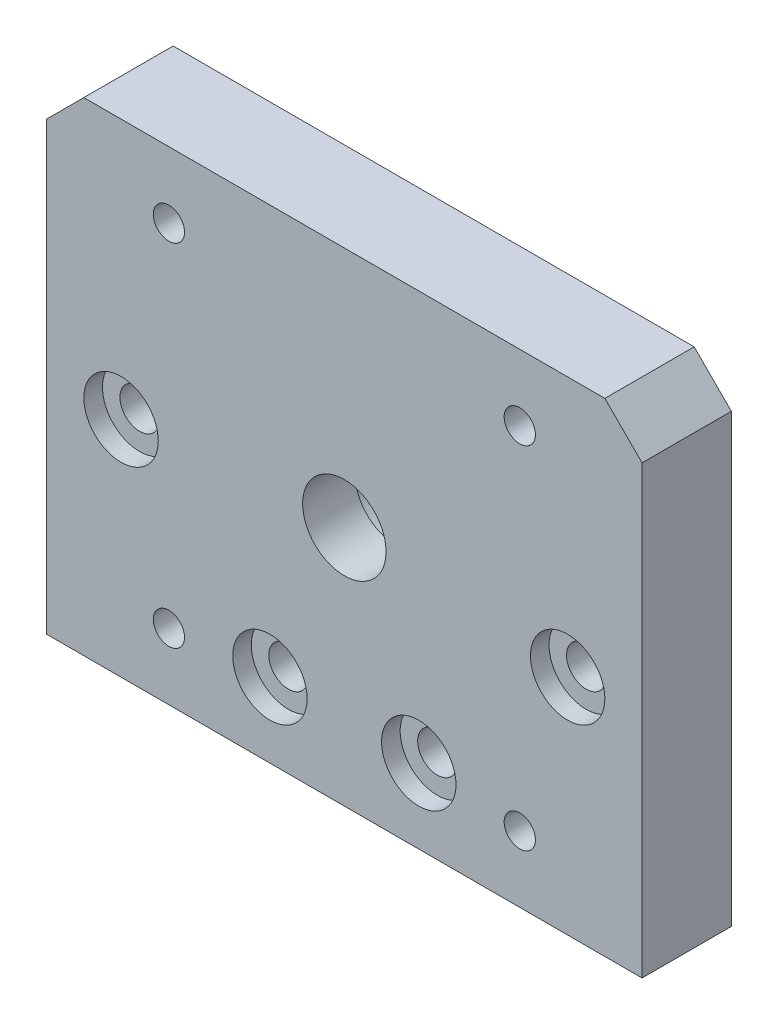
ISO-10303-21;
HEADER;
FILE_DESCRIPTION(('STEP AP214'),'2;1');
FILE_NAME('part.step','',(''),(''),'','','');
FILE_SCHEMA(('AUTOMOTIVE_DESIGN { 1 0 10303 214 1 1 1 1 }'));
ENDSEC;
DATA;
#1=APPLICATION_CONTEXT('core data for automotive mechanical design processes');
#2=APPLICATION_PROTOCOL_DEFINITION('international standard','automotive_design',2000,#1);
#3=PRODUCT_CONTEXT('',#1,'mechanical');
#4=PRODUCT('Part','Part','',(#3));
#5=PRODUCT_RELATED_PRODUCT_CATEGORY('part','',(#4));
#6=PRODUCT_DEFINITION_FORMATION('','',#4);
#7=PRODUCT_DEFINITION_CONTEXT('part definition',#1,'design');
#8=PRODUCT_DEFINITION('design','',#6,#7);
#9=PRODUCT_DEFINITION_SHAPE('','',#8);
#10=(LENGTH_UNIT() NAMED_UNIT(*) SI_UNIT(.MILLI.,.METRE.));
#11=(NAMED_UNIT(*) PLANE_ANGLE_UNIT() SI_UNIT($,.RADIAN.));
#12=(NAMED_UNIT(*) SI_UNIT($,.STERADIAN.) SOLID_ANGLE_UNIT());
#13=UNCERTAINTY_MEASURE_WITH_UNIT(LENGTH_MEASURE(1.E-05),#10,'distance_accuracy_value','');
#14=(GEOMETRIC_REPRESENTATION_CONTEXT(3) GLOBAL_UNCERTAINTY_ASSIGNED_CONTEXT((#13)) GLOBAL_UNIT_ASSIGNED_CONTEXT((#10,
#11,#12)) REPRESENTATION_CONTEXT('',''));
#15=CARTESIAN_POINT('',(0.,0.,0.));
#16=DIRECTION('',(0.,0.,1.));
#17=DIRECTION('',(1.,0.,0.));
#18=AXIS2_PLACEMENT_3D('',#15,#16,#17);
#19=CARTESIAN_POINT('',(0.,0.,0.));
#20=DIRECTION('',(0.,0.,1.));
#21=DIRECTION('',(1.,0.,0.));
#22=AXIS2_PLACEMENT_3D('',#19,#20,#21);
#23=CYLINDRICAL_SURFACE('',#22,5.6);
#24=CARTESIAN_POINT('',(0.,0.,12.));
#25=DIRECTION('',(0.,0.,1.));
#26=DIRECTION('',(1.,0.,0.));
#27=AXIS2_PLACEMENT_3D('',#24,#25,#26);
#28=CIRCLE('',#27,5.6);
#29=CARTESIAN_POINT('',(5.6,0.,12.));
#30=VERTEX_POINT('',#29);
#31=EDGE_CURVE('E340',#30,#30,#28,.T.);
#32=ORIENTED_EDGE('',*,*,#31,.T.);
#33=EDGE_LOOP('',(#32));
#34=FACE_BOUND('',#33,.T.);
#35=CARTESIAN_POINT('',(0.,0.,5.));
#36=DIRECTION('',(0.,0.,-1.));
#37=DIRECTION('',(-1.,0.,0.));
#38=AXIS2_PLACEMENT_3D('',#35,#36,#37);
#39=CIRCLE('',#38,5.6);
#40=CARTESIAN_POINT('',(-5.6,0.,5.));
#41=VERTEX_POINT('',#40);
#42=EDGE_CURVE('E45',#41,#41,#39,.F.);
#43=ORIENTED_EDGE('',*,*,#42,.F.);
#44=EDGE_LOOP('',(#43));
#45=FACE_BOUND('',#44,.T.);
#46=ADVANCED_FACE('F41',(#34,#45),#23,.F.);
#47=CARTESIAN_POINT('',(0.,0.,12.));
#48=DIRECTION('',(0.,0.,-1.));
#49=DIRECTION('',(-1.,0.,0.));
#50=AXIS2_PLACEMENT_3D('',#47,#48,#49);
#51=PLANE('',#50);
#52=ORIENTED_EDGE('',*,*,#31,.F.);
#53=EDGE_LOOP('',(#52));
#54=FACE_BOUND('',#53,.T.);
#55=CARTESIAN_POINT('',(-30.,-2.3999999999999,12.));
#56=DIRECTION('',(0.,0.,1.));
#57=DIRECTION('',(1.,0.,0.));
#58=AXIS2_PLACEMENT_3D('',#55,#56,#57);
#59=CIRCLE('',#58,5.);
#60=CARTESIAN_POINT('',(-25.,-2.3999999999999,12.));
#61=VERTEX_POINT('',#60);
#62=EDGE_CURVE('E337',#61,#61,#59,.T.);
#63=ORIENTED_EDGE('',*,*,#62,.F.);
#64=EDGE_LOOP('',(#63));
#65=FACE_BOUND('',#64,.T.);
#66=CARTESIAN_POINT('',(-10.,-22.3999999999999,12.));
#67=DIRECTION('',(0.,0.,1.));
#68=DIRECTION('',(1.,0.,0.));
#69=AXIS2_PLACEMENT_3D('',#66,#67,#68);
#70=CIRCLE('',#69,5.);
#71=CARTESIAN_POINT('',(-5.,-22.3999999999999,12.));
#72=VERTEX_POINT('',#71);
#73=EDGE_CURVE('E327',#72,#72,#70,.T.);
#74=ORIENTED_EDGE('',*,*,#73,.F.);
#75=EDGE_LOOP('',(#74));
#76=FACE_BOUND('',#75,.T.);
#77=CARTESIAN_POINT('',(10.,-22.3999999999999,12.));
#78=DIRECTION('',(0.,0.,1.));
#79=DIRECTION('',(1.,0.,0.));
#80=AXIS2_PLACEMENT_3D('',#77,#78,#79);
#81=CIRCLE('',#80,5.);
#82=CARTESIAN_POINT('',(15.,-22.3999999999999,12.));
#83=VERTEX_POINT('',#82);
#84=EDGE_CURVE('E317',#83,#83,#81,.T.);
#85=ORIENTED_EDGE('',*,*,#84,.F.);
#86=EDGE_LOOP('',(#85));
#87=FACE_BOUND('',#86,.T.);
#88=CARTESIAN_POINT('',(30.,-2.39999999999992,12.));
#89=DIRECTION('',(0.,0.,1.));
#90=DIRECTION('',(1.,0.,0.));
#91=AXIS2_PLACEMENT_3D('',#88,#89,#90);
#92=CIRCLE('',#91,5.);
#93=CARTESIAN_POINT('',(35.,-2.39999999999992,12.));
#94=VERTEX_POINT('',#93);
#95=EDGE_CURVE('E307',#94,#94,#92,.T.);
#96=ORIENTED_EDGE('',*,*,#95,.F.);
#97=EDGE_LOOP('',(#96));
#98=FACE_BOUND('',#97,.T.);
#99=CARTESIAN_POINT('',(-23.57,-23.5,12.));
#100=DIRECTION('',(0.,0.,1.));
#101=DIRECTION('',(1.,0.,0.));
#102=AXIS2_PLACEMENT_3D('',#99,#100,#101);
#103=CIRCLE('',#102,2.1);
#104=CARTESIAN_POINT('',(-21.47,-23.5,12.));
#105=VERTEX_POINT('',#104);
#106=EDGE_CURVE('E297',#105,#105,#103,.T.);
#107=ORIENTED_EDGE('',*,*,#106,.F.);
#108=EDGE_LOOP('',(#107));
#109=FACE_BOUND('',#108,.T.);
#110=CARTESIAN_POINT('',(-23.57,23.6400000000001,12.));
#111=DIRECTION('',(0.,0.,1.));
#112=DIRECTION('',(1.,0.,0.));
#113=AXIS2_PLACEMENT_3D('',#110,#111,#112);
#114=CIRCLE('',#113,2.1);
#115=CARTESIAN_POINT('',(-21.47,23.6400000000001,12.));
#116=VERTEX_POINT('',#115);
#117=EDGE_CURVE('E293',#116,#116,#114,.T.);
#118=ORIENTED_EDGE('',*,*,#117,.F.);
#119=EDGE_LOOP('',(#118));
#120=FACE_BOUND('',#119,.T.);
#121=CARTESIAN_POINT('',(23.57,23.6400000000001,12.));
#122=DIRECTION('',(0.,0.,1.));
#123=DIRECTION('',(1.,0.,0.));
#124=AXIS2_PLACEMENT_3D('',#121,#122,#123);
#125=CIRCLE('',#124,2.1);
#126=CARTESIAN_POINT('',(25.67,23.6400000000001,12.));
#127=VERTEX_POINT('',#126);
#128=EDGE_CURVE('E278',#127,#127,#125,.T.);
#129=ORIENTED_EDGE('',*,*,#128,.F.);
#130=EDGE_LOOP('',(#129));
#131=FACE_BOUND('',#130,.T.);
#132=DIRECTION('',(0.,-1.,0.));
#133=VECTOR('',#132,1.);
#134=CARTESIAN_POINT('',(-40.,-32.4,12.));
#135=LINE('',#134,#133);
#136=CARTESIAN_POINT('',(-40.,27.5400000000001,12.));
#137=VERTEX_POINT('',#136);
#138=CARTESIAN_POINT('',(-40.,-32.4,12.));
#139=VERTEX_POINT('',#138);
#140=EDGE_CURVE('E139',#137,#139,#135,.T.);
#141=ORIENTED_EDGE('',*,*,#140,.T.);
#142=DIRECTION('',(1.,0.,0.));
#143=VECTOR('',#142,1.);
#144=CARTESIAN_POINT('',(-40.,-32.4,12.));
#145=LINE('',#144,#143);
#146=CARTESIAN_POINT('',(40.,-32.4,12.));
#147=VERTEX_POINT('',#146);
#148=EDGE_CURVE('E96',#139,#147,#145,.T.);
#149=ORIENTED_EDGE('',*,*,#148,.T.);
#150=DIRECTION('',(0.,1.,0.));
#151=VECTOR('',#150,1.);
#152=CARTESIAN_POINT('',(40.,-32.4,12.));
#153=LINE('',#152,#151);
#154=CARTESIAN_POINT('',(40.,27.5400000000001,12.));
#155=VERTEX_POINT('',#154);
#156=EDGE_CURVE('E110',#147,#155,#153,.T.);
#157=ORIENTED_EDGE('',*,*,#156,.T.);
#158=DIRECTION('',(-0.707106781186547,0.707106781186548,0.));
#159=VECTOR('',#158,1.);
#160=CARTESIAN_POINT('',(35.,32.5400000000001,12.));
#161=LINE('',#160,#159);
#162=CARTESIAN_POINT('',(35.,32.5400000000001,12.));
#163=VERTEX_POINT('',#162);
#164=EDGE_CURVE('E103',#155,#163,#161,.T.);
#165=ORIENTED_EDGE('',*,*,#164,.T.);
#166=DIRECTION('',(-1.,0.,0.));
#167=VECTOR('',#166,1.);
#168=CARTESIAN_POINT('',(-35.,32.5400000000001,12.));
#169=LINE('',#168,#167);
#170=CARTESIAN_POINT('',(-35.,32.5400000000001,12.));
#171=VERTEX_POINT('',#170);
#172=EDGE_CURVE('E108',#163,#171,#169,.T.);
#173=ORIENTED_EDGE('',*,*,#172,.T.);
#174=DIRECTION('',(-0.707106781186547,-0.707106781186548,0.));
#175=VECTOR('',#174,1.);
#176=CARTESIAN_POINT('',(-40.,27.5400000000001,12.));
#177=LINE('',#176,#175);
#178=EDGE_CURVE('E59',#171,#137,#177,.T.);
#179=ORIENTED_EDGE('',*,*,#178,.T.);
#180=EDGE_LOOP('',(#141,#149,#157,#165,#173,#179));
#181=FACE_BOUND('',#180,.T.);
#182=CARTESIAN_POINT('',(23.57,-23.4999999999999,12.));
#183=DIRECTION('',(0.,0.,1.));
#184=DIRECTION('',(1.,0.,0.));
#185=AXIS2_PLACEMENT_3D('',#182,#183,#184);
#186=CIRCLE('',#185,2.1);
#187=CARTESIAN_POINT('',(25.67,-23.4999999999999,12.));
#188=VERTEX_POINT('',#187);
#189=EDGE_CURVE('E277',#188,#188,#186,.T.);
#190=ORIENTED_EDGE('',*,*,#189,.F.);
#191=EDGE_LOOP('',(#190));
#192=FACE_BOUND('',#191,.T.);
#193=ADVANCED_FACE('F105',(#54,#65,#76,#87,#98,#109,#120,#131,#181,#192),#51,.F.);
#194=CARTESIAN_POINT('',(0.,0.,0.));
#195=DIRECTION('',(0.,0.,-1.));
#196=DIRECTION('',(-1.,0.,0.));
#197=AXIS2_PLACEMENT_3D('',#194,#195,#196);
#198=PLANE('',#197);
#199=CARTESIAN_POINT('',(0.,0.,0.));
#200=DIRECTION('',(0.,0.,-1.));
#201=DIRECTION('',(-1.,0.,0.));
#202=AXIS2_PLACEMENT_3D('',#199,#200,#201);
#203=CIRCLE('',#202,8.);
#204=CARTESIAN_POINT('',(-8.,0.,0.));
#205=VERTEX_POINT('',#204);
#206=EDGE_CURVE('E249',#205,#205,#203,.T.);
#207=ORIENTED_EDGE('',*,*,#206,.F.);
#208=EDGE_LOOP('',(#207));
#209=FACE_BOUND('',#208,.T.);
#210=CARTESIAN_POINT('',(-30.,-2.3999999999999,0.));
#211=DIRECTION('',(0.,0.,1.));
#212=DIRECTION('',(1.,0.,0.));
#213=AXIS2_PLACEMENT_3D('',#210,#211,#212);
#214=CIRCLE('',#213,2.65);
#215=CARTESIAN_POINT('',(-27.35,-2.3999999999999,0.));
#216=VERTEX_POINT('',#215);
#217=EDGE_CURVE('E253',#216,#216,#214,.T.);
#218=ORIENTED_EDGE('',*,*,#217,.T.);
#219=EDGE_LOOP('',(#218));
#220=FACE_BOUND('',#219,.T.);
#221=CARTESIAN_POINT('',(-10.,-22.3999999999999,0.));
#222=DIRECTION('',(0.,0.,1.));
#223=DIRECTION('',(1.,0.,0.));
#224=AXIS2_PLACEMENT_3D('',#221,#222,#223);
#225=CIRCLE('',#224,2.65);
#226=CARTESIAN_POINT('',(-7.35,-22.3999999999999,0.));
#227=VERTEX_POINT('',#226);
#228=EDGE_CURVE('E257',#227,#227,#225,.T.);
#229=ORIENTED_EDGE('',*,*,#228,.T.);
#230=EDGE_LOOP('',(#229));
#231=FACE_BOUND('',#230,.T.);
#232=CARTESIAN_POINT('',(10.,-22.3999999999999,0.));
#233=DIRECTION('',(0.,0.,1.));
#234=DIRECTION('',(1.,0.,0.));
#235=AXIS2_PLACEMENT_3D('',#232,#233,#234);
#236=CIRCLE('',#235,2.65);
#237=CARTESIAN_POINT('',(12.65,-22.3999999999999,0.));
#238=VERTEX_POINT('',#237);
#239=EDGE_CURVE('E261',#238,#238,#236,.T.);
#240=ORIENTED_EDGE('',*,*,#239,.T.);
#241=EDGE_LOOP('',(#240));
#242=FACE_BOUND('',#241,.T.);
#243=CARTESIAN_POINT('',(30.,-2.39999999999992,0.));
#244=DIRECTION('',(0.,0.,1.));
#245=DIRECTION('',(1.,0.,0.));
#246=AXIS2_PLACEMENT_3D('',#243,#244,#245);
#247=CIRCLE('',#246,2.65);
#248=CARTESIAN_POINT('',(32.65,-2.39999999999992,0.));
#249=VERTEX_POINT('',#248);
#250=EDGE_CURVE('E265',#249,#249,#247,.T.);
#251=ORIENTED_EDGE('',*,*,#250,.T.);
#252=EDGE_LOOP('',(#251));
#253=FACE_BOUND('',#252,.T.);
#254=CARTESIAN_POINT('',(-23.57,-23.5,0.));
#255=DIRECTION('',(0.,0.,1.));
#256=DIRECTION('',(1.,0.,0.));
#257=AXIS2_PLACEMENT_3D('',#254,#255,#256);
#258=CIRCLE('',#257,2.09999999999999);
#259=CARTESIAN_POINT('',(-21.47,-23.5,0.));
#260=VERTEX_POINT('',#259);
#261=EDGE_CURVE('E269',#260,#260,#258,.T.);
#262=ORIENTED_EDGE('',*,*,#261,.T.);
#263=EDGE_LOOP('',(#262));
#264=FACE_BOUND('',#263,.T.);
#265=CARTESIAN_POINT('',(-23.57,23.6400000000001,0.));
#266=DIRECTION('',(0.,0.,1.));
#267=DIRECTION('',(1.,0.,0.));
#268=AXIS2_PLACEMENT_3D('',#265,#266,#267);
#269=CIRCLE('',#268,2.09999999999999);
#270=CARTESIAN_POINT('',(-21.47,23.6400000000001,0.));
#271=VERTEX_POINT('',#270);
#272=EDGE_CURVE('E273',#271,#271,#269,.T.);
#273=ORIENTED_EDGE('',*,*,#272,.T.);
#274=EDGE_LOOP('',(#273));
#275=FACE_BOUND('',#274,.T.);
#276=CARTESIAN_POINT('',(23.57,23.6400000000001,0.));
#277=DIRECTION('',(0.,0.,1.));
#278=DIRECTION('',(1.,0.,0.));
#279=AXIS2_PLACEMENT_3D('',#276,#277,#278);
#280=CIRCLE('',#279,2.09999999999999);
#281=CARTESIAN_POINT('',(25.67,23.6400000000001,0.));
#282=VERTEX_POINT('',#281);
#283=EDGE_CURVE('E276',#282,#282,#280,.T.);
#284=ORIENTED_EDGE('',*,*,#283,.T.);
#285=EDGE_LOOP('',(#284));
#286=FACE_BOUND('',#285,.T.);
#287=DIRECTION('',(0.,-1.,0.));
#288=VECTOR('',#287,1.);
#289=CARTESIAN_POINT('',(-40.,-32.4,0.));
#290=LINE('',#289,#288);
#291=CARTESIAN_POINT('',(-40.,27.5400000000001,0.));
#292=VERTEX_POINT('',#291);
#293=CARTESIAN_POINT('',(-40.,-32.4,0.));
#294=VERTEX_POINT('',#293);
#295=EDGE_CURVE('E128',#292,#294,#290,.T.);
#296=ORIENTED_EDGE('',*,*,#295,.F.);
#297=DIRECTION('',(-0.707106781186547,-0.707106781186548,0.));
#298=VECTOR('',#297,1.);
#299=CARTESIAN_POINT('',(-40.,27.5400000000001,0.));
#300=LINE('',#299,#298);
#301=CARTESIAN_POINT('',(-35.,32.5400000000001,0.));
#302=VERTEX_POINT('',#301);
#303=EDGE_CURVE('E88',#302,#292,#300,.T.);
#304=ORIENTED_EDGE('',*,*,#303,.F.);
#305=DIRECTION('',(-1.,0.,0.));
#306=VECTOR('',#305,1.);
#307=CARTESIAN_POINT('',(-35.,32.5400000000001,0.));
#308=LINE('',#307,#306);
#309=CARTESIAN_POINT('',(35.,32.5400000000001,0.));
#310=VERTEX_POINT('',#309);
#311=EDGE_CURVE('E82',#310,#302,#308,.T.);
#312=ORIENTED_EDGE('',*,*,#311,.F.);
#313=DIRECTION('',(-0.707106781186547,0.707106781186548,0.));
#314=VECTOR('',#313,1.);
#315=CARTESIAN_POINT('',(35.,32.5400000000001,0.));
#316=LINE('',#315,#314);
#317=CARTESIAN_POINT('',(40.,27.5400000000001,0.));
#318=VERTEX_POINT('',#317);
#319=EDGE_CURVE('E118',#318,#310,#316,.T.);
#320=ORIENTED_EDGE('',*,*,#319,.F.);
#321=DIRECTION('',(0.,1.,0.));
#322=VECTOR('',#321,1.);
#323=CARTESIAN_POINT('',(40.,-32.4,0.));
#324=LINE('',#323,#322);
#325=CARTESIAN_POINT('',(40.,-32.4,0.));
#326=VERTEX_POINT('',#325);
#327=EDGE_CURVE('E134',#326,#318,#324,.T.);
#328=ORIENTED_EDGE('',*,*,#327,.F.);
#329=DIRECTION('',(1.,0.,0.));
#330=VECTOR('',#329,1.);
#331=CARTESIAN_POINT('',(-40.,-32.4,0.));
#332=LINE('',#331,#330);
#333=EDGE_CURVE('E131',#294,#326,#332,.T.);
#334=ORIENTED_EDGE('',*,*,#333,.F.);
#335=EDGE_LOOP('',(#296,#304,#312,#320,#328,#334));
#336=FACE_BOUND('',#335,.T.);
#337=CARTESIAN_POINT('',(23.57,-23.4999999999999,0.));
#338=DIRECTION('',(0.,0.,1.));
#339=DIRECTION('',(1.,0.,0.));
#340=AXIS2_PLACEMENT_3D('',#337,#338,#339);
#341=CIRCLE('',#340,2.09999999999999);
#342=CARTESIAN_POINT('',(25.67,-23.4999999999999,0.));
#343=VERTEX_POINT('',#342);
#344=EDGE_CURVE('E132',#343,#343,#341,.T.);
#345=ORIENTED_EDGE('',*,*,#344,.T.);
#346=EDGE_LOOP('',(#345));
#347=FACE_BOUND('',#346,.T.);
#348=ADVANCED_FACE('F149',(#209,#220,#231,#242,#253,#264,#275,#286,#336,#347),#198,.T.);
#349=CARTESIAN_POINT('',(-40.,-32.4,12.));
#350=DIRECTION('',(1.,0.,0.));
#351=DIRECTION('',(0.,0.,-1.));
#352=AXIS2_PLACEMENT_3D('',#349,#350,#351);
#353=PLANE('',#352);
#354=ORIENTED_EDGE('',*,*,#295,.T.);
#355=DIRECTION('',(0.,0.,-1.));
#356=VECTOR('',#355,1.);
#357=CARTESIAN_POINT('',(-40.,-32.4,12.));
#358=LINE('',#357,#356);
#359=EDGE_CURVE('E11',#139,#294,#358,.T.);
#360=ORIENTED_EDGE('',*,*,#359,.F.);
#361=ORIENTED_EDGE('',*,*,#140,.F.);
#362=DIRECTION('',(0.,0.,-1.));
#363=VECTOR('',#362,1.);
#364=CARTESIAN_POINT('',(-40.,27.5400000000001,12.));
#365=LINE('',#364,#363);
#366=EDGE_CURVE('E124',#137,#292,#365,.T.);
#367=ORIENTED_EDGE('',*,*,#366,.T.);
#368=EDGE_LOOP('',(#354,#360,#361,#367));
#369=FACE_BOUND('',#368,.T.);
#370=ADVANCED_FACE('F43',(#369),#353,.F.);
#371=CARTESIAN_POINT('',(-40.,-32.4,12.));
#372=DIRECTION('',(0.,1.,0.));
#373=DIRECTION('',(0.,0.,1.));
#374=AXIS2_PLACEMENT_3D('',#371,#372,#373);
#375=PLANE('',#374);
#376=ORIENTED_EDGE('',*,*,#333,.T.);
#377=DIRECTION('',(0.,0.,-1.));
#378=VECTOR('',#377,1.);
#379=CARTESIAN_POINT('',(40.,-32.4,12.));
#380=LINE('',#379,#378);
#381=EDGE_CURVE('E51',#147,#326,#380,.T.);
#382=ORIENTED_EDGE('',*,*,#381,.F.);
#383=ORIENTED_EDGE('',*,*,#148,.F.);
#384=ORIENTED_EDGE('',*,*,#359,.T.);
#385=EDGE_LOOP('',(#376,#382,#383,#384));
#386=FACE_BOUND('',#385,.T.);
#387=ADVANCED_FACE('F245',(#386),#375,.F.);
#388=CARTESIAN_POINT('',(40.,-32.4,12.));
#389=DIRECTION('',(-1.,0.,0.));
#390=DIRECTION('',(0.,0.,1.));
#391=AXIS2_PLACEMENT_3D('',#388,#389,#390);
#392=PLANE('',#391);
#393=ORIENTED_EDGE('',*,*,#327,.T.);
#394=DIRECTION('',(0.,0.,-1.));
#395=VECTOR('',#394,1.);
#396=CARTESIAN_POINT('',(40.,27.5400000000001,12.));
#397=LINE('',#396,#395);
#398=EDGE_CURVE('E119',#155,#318,#397,.T.);
#399=ORIENTED_EDGE('',*,*,#398,.F.);
#400=ORIENTED_EDGE('',*,*,#156,.F.);
#401=ORIENTED_EDGE('',*,*,#381,.T.);
#402=EDGE_LOOP('',(#393,#399,#400,#401));
#403=FACE_BOUND('',#402,.T.);
#404=ADVANCED_FACE('F146',(#403),#392,.F.);
#405=CARTESIAN_POINT('',(35.,32.5400000000001,12.));
#406=DIRECTION('',(-0.707106781186548,-0.707106781186547,0.));
#407=DIRECTION('',(0.707106781186547,-0.707106781186548,0.));
#408=AXIS2_PLACEMENT_3D('',#405,#406,#407);
#409=PLANE('',#408);
#410=ORIENTED_EDGE('',*,*,#319,.T.);
#411=DIRECTION('',(0.,0.,-1.));
#412=VECTOR('',#411,1.);
#413=CARTESIAN_POINT('',(35.,32.5400000000001,12.));
#414=LINE('',#413,#412);
#415=EDGE_CURVE('E115',#163,#310,#414,.T.);
#416=ORIENTED_EDGE('',*,*,#415,.F.);
#417=ORIENTED_EDGE('',*,*,#164,.F.);
#418=ORIENTED_EDGE('',*,*,#398,.T.);
#419=EDGE_LOOP('',(#410,#416,#417,#418));
#420=FACE_BOUND('',#419,.T.);
#421=ADVANCED_FACE('F116',(#420),#409,.F.);
#422=CARTESIAN_POINT('',(-35.,32.5400000000001,12.));
#423=DIRECTION('',(0.,-1.,0.));
#424=DIRECTION('',(0.,0.,-1.));
#425=AXIS2_PLACEMENT_3D('',#422,#423,#424);
#426=PLANE('',#425);
#427=ORIENTED_EDGE('',*,*,#311,.T.);
#428=DIRECTION('',(0.,0.,-1.));
#429=VECTOR('',#428,1.);
#430=CARTESIAN_POINT('',(-35.,32.5400000000001,12.));
#431=LINE('',#430,#429);
#432=EDGE_CURVE('E120',#171,#302,#431,.T.);
#433=ORIENTED_EDGE('',*,*,#432,.F.);
#434=ORIENTED_EDGE('',*,*,#172,.F.);
#435=ORIENTED_EDGE('',*,*,#415,.T.);
#436=EDGE_LOOP('',(#427,#433,#434,#435));
#437=FACE_BOUND('',#436,.T.);
#438=ADVANCED_FACE('F122',(#437),#426,.F.);
#439=CARTESIAN_POINT('',(-40.,27.5400000000001,12.));
#440=DIRECTION('',(0.707106781186548,-0.707106781186547,0.));
#441=DIRECTION('',(0.707106781186547,0.707106781186548,0.));
#442=AXIS2_PLACEMENT_3D('',#439,#440,#441);
#443=PLANE('',#442);
#444=ORIENTED_EDGE('',*,*,#303,.T.);
#445=ORIENTED_EDGE('',*,*,#366,.F.);
#446=ORIENTED_EDGE('',*,*,#178,.F.);
#447=ORIENTED_EDGE('',*,*,#432,.T.);
#448=EDGE_LOOP('',(#444,#445,#446,#447));
#449=FACE_BOUND('',#448,.T.);
#450=ADVANCED_FACE('F154',(#449),#443,.F.);
#451=CARTESIAN_POINT('',(23.57,-23.4999999999999,12.));
#452=DIRECTION('',(0.,0.,1.));
#453=DIRECTION('',(1.,0.,0.));
#454=AXIS2_PLACEMENT_3D('',#451,#452,#453);
#455=CYLINDRICAL_SURFACE('',#454,2.1);
#456=ORIENTED_EDGE('',*,*,#344,.F.);
#457=EDGE_LOOP('',(#456));
#458=FACE_BOUND('',#457,.T.);
#459=ORIENTED_EDGE('',*,*,#189,.T.);
#460=EDGE_LOOP('',(#459));
#461=FACE_BOUND('',#460,.T.);
#462=ADVANCED_FACE('F156',(#458,#461),#455,.F.);
#463=CARTESIAN_POINT('',(23.57,23.6400000000001,12.));
#464=DIRECTION('',(0.,0.,1.));
#465=DIRECTION('',(1.,0.,0.));
#466=AXIS2_PLACEMENT_3D('',#463,#464,#465);
#467=CYLINDRICAL_SURFACE('',#466,2.1);
#468=ORIENTED_EDGE('',*,*,#283,.F.);
#469=EDGE_LOOP('',(#468));
#470=FACE_BOUND('',#469,.T.);
#471=ORIENTED_EDGE('',*,*,#128,.T.);
#472=EDGE_LOOP('',(#471));
#473=FACE_BOUND('',#472,.T.);
#474=ADVANCED_FACE('F162',(#470,#473),#467,.F.);
#475=CARTESIAN_POINT('',(-23.57,23.6400000000001,12.));
#476=DIRECTION('',(0.,0.,1.));
#477=DIRECTION('',(1.,0.,0.));
#478=AXIS2_PLACEMENT_3D('',#475,#476,#477);
#479=CYLINDRICAL_SURFACE('',#478,2.1);
#480=ORIENTED_EDGE('',*,*,#272,.F.);
#481=EDGE_LOOP('',(#480));
#482=FACE_BOUND('',#481,.T.);
#483=ORIENTED_EDGE('',*,*,#117,.T.);
#484=EDGE_LOOP('',(#483));
#485=FACE_BOUND('',#484,.T.);
#486=ADVANCED_FACE('F233',(#482,#485),#479,.F.);
#487=CARTESIAN_POINT('',(-23.57,-23.5,12.));
#488=DIRECTION('',(0.,0.,1.));
#489=DIRECTION('',(1.,0.,0.));
#490=AXIS2_PLACEMENT_3D('',#487,#488,#489);
#491=CYLINDRICAL_SURFACE('',#490,2.1);
#492=ORIENTED_EDGE('',*,*,#261,.F.);
#493=EDGE_LOOP('',(#492));
#494=FACE_BOUND('',#493,.T.);
#495=ORIENTED_EDGE('',*,*,#106,.T.);
#496=EDGE_LOOP('',(#495));
#497=FACE_BOUND('',#496,.T.);
#498=ADVANCED_FACE('F229',(#494,#497),#491,.F.);
#499=CARTESIAN_POINT('',(30.,-2.39999999999992,12.));
#500=DIRECTION('',(0.,0.,1.));
#501=DIRECTION('',(1.,0.,0.));
#502=AXIS2_PLACEMENT_3D('',#499,#500,#501);
#503=CYLINDRICAL_SURFACE('',#502,2.65);
#504=ORIENTED_EDGE('',*,*,#250,.F.);
#505=EDGE_LOOP('',(#504));
#506=FACE_BOUND('',#505,.T.);
#507=CARTESIAN_POINT('',(30.,-2.39999999999992,9.5));
#508=DIRECTION('',(0.,0.,1.));
#509=DIRECTION('',(1.,0.,0.));
#510=AXIS2_PLACEMENT_3D('',#507,#508,#509);
#511=CIRCLE('',#510,2.65);
#512=CARTESIAN_POINT('',(32.65,-2.39999999999992,9.5));
#513=VERTEX_POINT('',#512);
#514=EDGE_CURVE('E301',#513,#513,#511,.T.);
#515=ORIENTED_EDGE('',*,*,#514,.T.);
#516=EDGE_LOOP('',(#515));
#517=FACE_BOUND('',#516,.T.);
#518=ADVANCED_FACE('F225',(#506,#517),#503,.F.);
#519=CARTESIAN_POINT('',(32.65,-2.39999999999992,9.5));
#520=DIRECTION('',(0.,0.,-1.));
#521=DIRECTION('',(-1.,0.,0.));
#522=AXIS2_PLACEMENT_3D('',#519,#520,#521);
#523=PLANE('',#522);
#524=ORIENTED_EDGE('',*,*,#514,.F.);
#525=EDGE_LOOP('',(#524));
#526=FACE_BOUND('',#525,.T.);
#527=CARTESIAN_POINT('',(30.,-2.39999999999992,9.5));
#528=DIRECTION('',(0.,0.,1.));
#529=DIRECTION('',(1.,0.,0.));
#530=AXIS2_PLACEMENT_3D('',#527,#528,#529);
#531=CIRCLE('',#530,5.);
#532=CARTESIAN_POINT('',(35.,-2.39999999999992,9.5));
#533=VERTEX_POINT('',#532);
#534=EDGE_CURVE('E304',#533,#533,#531,.T.);
#535=ORIENTED_EDGE('',*,*,#534,.T.);
#536=EDGE_LOOP('',(#535));
#537=FACE_BOUND('',#536,.T.);
#538=ADVANCED_FACE('F221',(#526,#537),#523,.F.);
#539=CARTESIAN_POINT('',(30.,-2.39999999999992,12.));
#540=DIRECTION('',(0.,0.,1.));
#541=DIRECTION('',(1.,0.,0.));
#542=AXIS2_PLACEMENT_3D('',#539,#540,#541);
#543=CYLINDRICAL_SURFACE('',#542,5.);
#544=ORIENTED_EDGE('',*,*,#534,.F.);
#545=EDGE_LOOP('',(#544));
#546=FACE_BOUND('',#545,.T.);
#547=ORIENTED_EDGE('',*,*,#95,.T.);
#548=EDGE_LOOP('',(#547));
#549=FACE_BOUND('',#548,.T.);
#550=ADVANCED_FACE('F217',(#546,#549),#543,.F.);
#551=CARTESIAN_POINT('',(10.,-22.3999999999999,12.));
#552=DIRECTION('',(0.,0.,1.));
#553=DIRECTION('',(1.,0.,0.));
#554=AXIS2_PLACEMENT_3D('',#551,#552,#553);
#555=CYLINDRICAL_SURFACE('',#554,2.65);
#556=ORIENTED_EDGE('',*,*,#239,.F.);
#557=EDGE_LOOP('',(#556));
#558=FACE_BOUND('',#557,.T.);
#559=CARTESIAN_POINT('',(10.,-22.3999999999999,9.5));
#560=DIRECTION('',(0.,0.,1.));
#561=DIRECTION('',(1.,0.,0.));
#562=AXIS2_PLACEMENT_3D('',#559,#560,#561);
#563=CIRCLE('',#562,2.65);
#564=CARTESIAN_POINT('',(12.65,-22.3999999999999,9.5));
#565=VERTEX_POINT('',#564);
#566=EDGE_CURVE('E311',#565,#565,#563,.T.);
#567=ORIENTED_EDGE('',*,*,#566,.T.);
#568=EDGE_LOOP('',(#567));
#569=FACE_BOUND('',#568,.T.);
#570=ADVANCED_FACE('F213',(#558,#569),#555,.F.);
#571=CARTESIAN_POINT('',(12.65,-22.3999999999999,9.5));
#572=DIRECTION('',(0.,0.,-1.));
#573=DIRECTION('',(-1.,0.,0.));
#574=AXIS2_PLACEMENT_3D('',#571,#572,#573);
#575=PLANE('',#574);
#576=ORIENTED_EDGE('',*,*,#566,.F.);
#577=EDGE_LOOP('',(#576));
#578=FACE_BOUND('',#577,.T.);
#579=CARTESIAN_POINT('',(10.,-22.3999999999999,9.5));
#580=DIRECTION('',(0.,0.,1.));
#581=DIRECTION('',(1.,0.,0.));
#582=AXIS2_PLACEMENT_3D('',#579,#580,#581);
#583=CIRCLE('',#582,5.);
#584=CARTESIAN_POINT('',(15.,-22.3999999999999,9.5));
#585=VERTEX_POINT('',#584);
#586=EDGE_CURVE('E314',#585,#585,#583,.T.);
#587=ORIENTED_EDGE('',*,*,#586,.T.);
#588=EDGE_LOOP('',(#587));
#589=FACE_BOUND('',#588,.T.);
#590=ADVANCED_FACE('F209',(#578,#589),#575,.F.);
#591=CARTESIAN_POINT('',(10.,-22.3999999999999,12.));
#592=DIRECTION('',(0.,0.,1.));
#593=DIRECTION('',(1.,0.,0.));
#594=AXIS2_PLACEMENT_3D('',#591,#592,#593);
#595=CYLINDRICAL_SURFACE('',#594,5.);
#596=ORIENTED_EDGE('',*,*,#586,.F.);
#597=EDGE_LOOP('',(#596));
#598=FACE_BOUND('',#597,.T.);
#599=ORIENTED_EDGE('',*,*,#84,.T.);
#600=EDGE_LOOP('',(#599));
#601=FACE_BOUND('',#600,.T.);
#602=ADVANCED_FACE('F205',(#598,#601),#595,.F.);
#603=CARTESIAN_POINT('',(-10.,-22.3999999999999,12.));
#604=DIRECTION('',(0.,0.,1.));
#605=DIRECTION('',(1.,0.,0.));
#606=AXIS2_PLACEMENT_3D('',#603,#604,#605);
#607=CYLINDRICAL_SURFACE('',#606,2.65);
#608=ORIENTED_EDGE('',*,*,#228,.F.);
#609=EDGE_LOOP('',(#608));
#610=FACE_BOUND('',#609,.T.);
#611=CARTESIAN_POINT('',(-10.,-22.3999999999999,9.5));
#612=DIRECTION('',(0.,0.,1.));
#613=DIRECTION('',(1.,0.,0.));
#614=AXIS2_PLACEMENT_3D('',#611,#612,#613);
#615=CIRCLE('',#614,2.65);
#616=CARTESIAN_POINT('',(-7.35,-22.3999999999999,9.5));
#617=VERTEX_POINT('',#616);
#618=EDGE_CURVE('E321',#617,#617,#615,.T.);
#619=ORIENTED_EDGE('',*,*,#618,.T.);
#620=EDGE_LOOP('',(#619));
#621=FACE_BOUND('',#620,.T.);
#622=ADVANCED_FACE('F201',(#610,#621),#607,.F.);
#623=CARTESIAN_POINT('',(-7.35,-22.3999999999999,9.5));
#624=DIRECTION('',(0.,0.,-1.));
#625=DIRECTION('',(-1.,0.,0.));
#626=AXIS2_PLACEMENT_3D('',#623,#624,#625);
#627=PLANE('',#626);
#628=ORIENTED_EDGE('',*,*,#618,.F.);
#629=EDGE_LOOP('',(#628));
#630=FACE_BOUND('',#629,.T.);
#631=CARTESIAN_POINT('',(-10.,-22.3999999999999,9.5));
#632=DIRECTION('',(0.,0.,1.));
#633=DIRECTION('',(1.,0.,0.));
#634=AXIS2_PLACEMENT_3D('',#631,#632,#633);
#635=CIRCLE('',#634,5.);
#636=CARTESIAN_POINT('',(-5.,-22.3999999999999,9.5));
#637=VERTEX_POINT('',#636);
#638=EDGE_CURVE('E324',#637,#637,#635,.T.);
#639=ORIENTED_EDGE('',*,*,#638,.T.);
#640=EDGE_LOOP('',(#639));
#641=FACE_BOUND('',#640,.T.);
#642=ADVANCED_FACE('F197',(#630,#641),#627,.F.);
#643=CARTESIAN_POINT('',(-10.,-22.3999999999999,12.));
#644=DIRECTION('',(0.,0.,1.));
#645=DIRECTION('',(1.,0.,0.));
#646=AXIS2_PLACEMENT_3D('',#643,#644,#645);
#647=CYLINDRICAL_SURFACE('',#646,5.);
#648=ORIENTED_EDGE('',*,*,#638,.F.);
#649=EDGE_LOOP('',(#648));
#650=FACE_BOUND('',#649,.T.);
#651=ORIENTED_EDGE('',*,*,#73,.T.);
#652=EDGE_LOOP('',(#651));
#653=FACE_BOUND('',#652,.T.);
#654=ADVANCED_FACE('F193',(#650,#653),#647,.F.);
#655=CARTESIAN_POINT('',(-30.,-2.3999999999999,12.));
#656=DIRECTION('',(0.,0.,1.));
#657=DIRECTION('',(1.,0.,0.));
#658=AXIS2_PLACEMENT_3D('',#655,#656,#657);
#659=CYLINDRICAL_SURFACE('',#658,2.65);
#660=ORIENTED_EDGE('',*,*,#217,.F.);
#661=EDGE_LOOP('',(#660));
#662=FACE_BOUND('',#661,.T.);
#663=CARTESIAN_POINT('',(-30.,-2.3999999999999,9.5));
#664=DIRECTION('',(0.,0.,1.));
#665=DIRECTION('',(1.,0.,0.));
#666=AXIS2_PLACEMENT_3D('',#663,#664,#665);
#667=CIRCLE('',#666,2.65);
#668=CARTESIAN_POINT('',(-27.35,-2.3999999999999,9.5));
#669=VERTEX_POINT('',#668);
#670=EDGE_CURVE('E331',#669,#669,#667,.T.);
#671=ORIENTED_EDGE('',*,*,#670,.T.);
#672=EDGE_LOOP('',(#671));
#673=FACE_BOUND('',#672,.T.);
#674=ADVANCED_FACE('F189',(#662,#673),#659,.F.);
#675=CARTESIAN_POINT('',(-27.35,-2.3999999999999,9.5));
#676=DIRECTION('',(0.,0.,-1.));
#677=DIRECTION('',(-1.,0.,0.));
#678=AXIS2_PLACEMENT_3D('',#675,#676,#677);
#679=PLANE('',#678);
#680=ORIENTED_EDGE('',*,*,#670,.F.);
#681=EDGE_LOOP('',(#680));
#682=FACE_BOUND('',#681,.T.);
#683=CARTESIAN_POINT('',(-30.,-2.3999999999999,9.5));
#684=DIRECTION('',(0.,0.,1.));
#685=DIRECTION('',(1.,0.,0.));
#686=AXIS2_PLACEMENT_3D('',#683,#684,#685);
#687=CIRCLE('',#686,5.);
#688=CARTESIAN_POINT('',(-25.,-2.3999999999999,9.5));
#689=VERTEX_POINT('',#688);
#690=EDGE_CURVE('E334',#689,#689,#687,.T.);
#691=ORIENTED_EDGE('',*,*,#690,.T.);
#692=EDGE_LOOP('',(#691));
#693=FACE_BOUND('',#692,.T.);
#694=ADVANCED_FACE('F185',(#682,#693),#679,.F.);
#695=CARTESIAN_POINT('',(-30.,-2.3999999999999,12.));
#696=DIRECTION('',(0.,0.,1.));
#697=DIRECTION('',(1.,0.,0.));
#698=AXIS2_PLACEMENT_3D('',#695,#696,#697);
#699=CYLINDRICAL_SURFACE('',#698,5.);
#700=ORIENTED_EDGE('',*,*,#690,.F.);
#701=EDGE_LOOP('',(#700));
#702=FACE_BOUND('',#701,.T.);
#703=ORIENTED_EDGE('',*,*,#62,.T.);
#704=EDGE_LOOP('',(#703));
#705=FACE_BOUND('',#704,.T.);
#706=ADVANCED_FACE('F181',(#702,#705),#699,.F.);
#707=CARTESIAN_POINT('',(0.,0.,5.));
#708=DIRECTION('',(0.,0.,-1.));
#709=DIRECTION('',(-1.,0.,0.));
#710=AXIS2_PLACEMENT_3D('',#707,#708,#709);
#711=PLANE('',#710);
#712=CARTESIAN_POINT('',(0.,0.,5.));
#713=DIRECTION('',(0.,0.,-1.));
#714=DIRECTION('',(-1.,0.,0.));
#715=AXIS2_PLACEMENT_3D('',#712,#713,#714);
#716=CIRCLE('',#715,8.);
#717=CARTESIAN_POINT('',(-8.,0.,5.));
#718=VERTEX_POINT('',#717);
#719=EDGE_CURVE('E343',#718,#718,#716,.T.);
#720=ORIENTED_EDGE('',*,*,#719,.T.);
#721=EDGE_LOOP('',(#720));
#722=FACE_BOUND('',#721,.T.);
#723=ORIENTED_EDGE('',*,*,#42,.T.);
#724=EDGE_LOOP('',(#723));
#725=FACE_BOUND('',#724,.T.);
#726=ADVANCED_FACE('F184',(#722,#725),#711,.T.);
#727=CARTESIAN_POINT('',(0.,0.,5.));
#728=DIRECTION('',(0.,0.,-1.));
#729=DIRECTION('',(-1.,0.,0.));
#730=AXIS2_PLACEMENT_3D('',#727,#728,#729);
#731=CYLINDRICAL_SURFACE('',#730,8.);
#732=ORIENTED_EDGE('',*,*,#719,.F.);
#733=EDGE_LOOP('',(#732));
#734=FACE_BOUND('',#733,.T.);
#735=ORIENTED_EDGE('',*,*,#206,.T.);
#736=EDGE_LOOP('',(#735));
#737=FACE_BOUND('',#736,.T.);
#738=ADVANCED_FACE('F179',(#734,#737),#731,.F.);
#739=CLOSED_SHELL('',(#46,#193,#348,#370,#387,#404,#421,#438,#450,#462,#474,#486,#498,#518,#538,
#550,#570,#590,#602,#622,#642,#654,#674,#694,#706,#726,#738));
#740=MANIFOLD_SOLID_BREP('B2',#739);
#741=ADVANCED_BREP_SHAPE_REPRESENTATION('',(#18,#740),#14);
#742=SHAPE_DEFINITION_REPRESENTATION(#9,#741);
ENDSEC;
END-ISO-10303-21;
